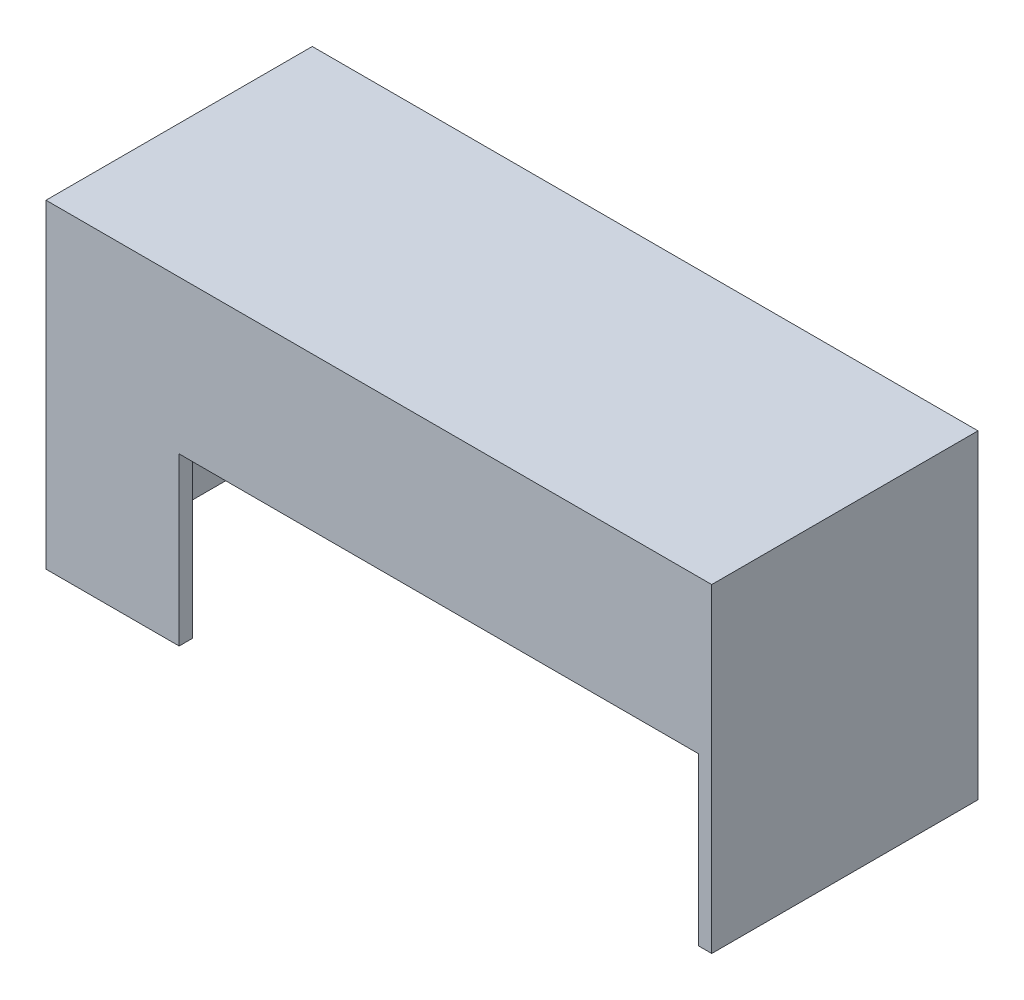
ISO-10303-21;
HEADER;
FILE_DESCRIPTION(('STEP AP214'),'2;1');
FILE_NAME('part.step','',(''),(''),'','','');
FILE_SCHEMA(('AUTOMOTIVE_DESIGN { 1 0 10303 214 1 1 1 1 }'));
ENDSEC;
DATA;
#1=APPLICATION_CONTEXT('core data for automotive mechanical design processes');
#2=APPLICATION_PROTOCOL_DEFINITION('international standard','automotive_design',2000,#1);
#3=PRODUCT_CONTEXT('',#1,'mechanical');
#4=PRODUCT('Part','Part','',(#3));
#5=PRODUCT_RELATED_PRODUCT_CATEGORY('part','',(#4));
#6=PRODUCT_DEFINITION_FORMATION('','',#4);
#7=PRODUCT_DEFINITION_CONTEXT('part definition',#1,'design');
#8=PRODUCT_DEFINITION('design','',#6,#7);
#9=PRODUCT_DEFINITION_SHAPE('','',#8);
#10=(LENGTH_UNIT() NAMED_UNIT(*) SI_UNIT(.MILLI.,.METRE.));
#11=(NAMED_UNIT(*) PLANE_ANGLE_UNIT() SI_UNIT($,.RADIAN.));
#12=(NAMED_UNIT(*) SI_UNIT($,.STERADIAN.) SOLID_ANGLE_UNIT());
#13=UNCERTAINTY_MEASURE_WITH_UNIT(LENGTH_MEASURE(1.E-05),#10,'distance_accuracy_value','');
#14=(GEOMETRIC_REPRESENTATION_CONTEXT(3) GLOBAL_UNCERTAINTY_ASSIGNED_CONTEXT((#13)) GLOBAL_UNIT_ASSIGNED_CONTEXT((#10,
#11,#12)) REPRESENTATION_CONTEXT('',''));
#15=CARTESIAN_POINT('',(0.,0.,0.));
#16=DIRECTION('',(0.,0.,1.));
#17=DIRECTION('',(1.,0.,0.));
#18=AXIS2_PLACEMENT_3D('',#15,#16,#17);
#19=CARTESIAN_POINT('',(-45.3195139385275,25.8398856325947,40.));
#20=DIRECTION('',(1.,0.,0.));
#21=DIRECTION('',(0.,1.,0.));
#22=AXIS2_PLACEMENT_3D('',#19,#20,#21);
#23=PLANE('',#22);
#24=DIRECTION('',(0.,-1.,0.));
#25=VECTOR('',#24,1.);
#26=CARTESIAN_POINT('',(-45.3195139385275,25.8398856325947,2.));
#27=LINE('',#26,#25);
#28=CARTESIAN_POINT('',(-45.3195139385275,23.8398856325947,2.));
#29=VERTEX_POINT('',#28);
#30=CARTESIAN_POINT('',(-45.3195139385275,-22.1601143674053,2.));
#31=VERTEX_POINT('',#30);
#32=EDGE_CURVE('E177',#29,#31,#27,.T.);
#33=ORIENTED_EDGE('',*,*,#32,.F.);
#34=DIRECTION('',(0.,0.,-1.));
#35=VECTOR('',#34,1.);
#36=CARTESIAN_POINT('',(-45.3195139385275,23.8398856325947,40.));
#37=LINE('',#36,#35);
#38=CARTESIAN_POINT('',(-45.3195139385275,23.8398856325947,38.));
#39=VERTEX_POINT('',#38);
#40=EDGE_CURVE('E247',#39,#29,#37,.T.);
#41=ORIENTED_EDGE('',*,*,#40,.F.);
#42=DIRECTION('',(0.,-1.,0.));
#43=VECTOR('',#42,1.);
#44=CARTESIAN_POINT('',(-45.3195139385275,25.8398856325947,38.));
#45=LINE('',#44,#43);
#46=CARTESIAN_POINT('',(-45.3195139385275,-22.1601143674053,38.));
#47=VERTEX_POINT('',#46);
#48=EDGE_CURVE('E148',#39,#47,#45,.T.);
#49=ORIENTED_EDGE('',*,*,#48,.T.);
#50=DIRECTION('',(0.,0.,-1.));
#51=VECTOR('',#50,1.);
#52=CARTESIAN_POINT('',(-45.3195139385275,-22.1601143674053,40.));
#53=LINE('',#52,#51);
#54=EDGE_CURVE('E108',#47,#31,#53,.T.);
#55=ORIENTED_EDGE('',*,*,#54,.T.);
#56=EDGE_LOOP('',(#33,#41,#49,#55));
#57=FACE_BOUND('',#56,.T.);
#58=ADVANCED_FACE('F44',(#57),#23,.T.);
#59=CARTESIAN_POINT('',(50.6804860614725,25.8398856325947,40.));
#60=DIRECTION('',(-1.,0.,0.));
#61=DIRECTION('',(0.,0.,1.));
#62=AXIS2_PLACEMENT_3D('',#59,#60,#61);
#63=PLANE('',#62);
#64=DIRECTION('',(0.,1.,0.));
#65=VECTOR('',#64,1.);
#66=CARTESIAN_POINT('',(50.6804860614725,25.8398856325947,40.));
#67=LINE('',#66,#65);
#68=CARTESIAN_POINT('',(50.6804860614725,-22.1601143674053,40.));
#69=VERTEX_POINT('',#68);
#70=CARTESIAN_POINT('',(50.6804860614725,2.83988563259471,40.));
#71=VERTEX_POINT('',#70);
#72=EDGE_CURVE('E189',#69,#71,#67,.T.);
#73=ORIENTED_EDGE('',*,*,#72,.T.);
#74=DIRECTION('',(0.,0.,-1.));
#75=VECTOR('',#74,1.);
#76=CARTESIAN_POINT('',(50.6804860614725,2.83988563259471,40.));
#77=LINE('',#76,#75);
#78=CARTESIAN_POINT('',(50.6804860614725,2.83988563259471,38.));
#79=VERTEX_POINT('',#78);
#80=EDGE_CURVE('E161',#71,#79,#77,.T.);
#81=ORIENTED_EDGE('',*,*,#80,.T.);
#82=DIRECTION('',(0.,1.,0.));
#83=VECTOR('',#82,1.);
#84=CARTESIAN_POINT('',(50.6804860614725,25.8398856325947,38.));
#85=LINE('',#84,#83);
#86=CARTESIAN_POINT('',(50.6804860614725,23.8398856325947,38.));
#87=VERTEX_POINT('',#86);
#88=EDGE_CURVE('E240',#79,#87,#85,.T.);
#89=ORIENTED_EDGE('',*,*,#88,.T.);
#90=DIRECTION('',(0.,0.,-1.));
#91=VECTOR('',#90,1.);
#92=CARTESIAN_POINT('',(50.6804860614725,23.8398856325947,40.));
#93=LINE('',#92,#91);
#94=CARTESIAN_POINT('',(50.6804860614725,23.8398856325947,2.));
#95=VERTEX_POINT('',#94);
#96=EDGE_CURVE('E154',#87,#95,#93,.T.);
#97=ORIENTED_EDGE('',*,*,#96,.T.);
#98=DIRECTION('',(0.,1.,0.));
#99=VECTOR('',#98,1.);
#100=CARTESIAN_POINT('',(50.6804860614725,25.8398856325947,2.));
#101=LINE('',#100,#99);
#102=CARTESIAN_POINT('',(50.6804860614725,-22.1601143674053,2.));
#103=VERTEX_POINT('',#102);
#104=EDGE_CURVE('E185',#103,#95,#101,.T.);
#105=ORIENTED_EDGE('',*,*,#104,.F.);
#106=DIRECTION('',(0.,0.,-1.));
#107=VECTOR('',#106,1.);
#108=CARTESIAN_POINT('',(50.6804860614725,-22.1601143674053,40.));
#109=LINE('',#108,#107);
#110=EDGE_CURVE('E114',#69,#103,#109,.T.);
#111=ORIENTED_EDGE('',*,*,#110,.F.);
#112=EDGE_LOOP('',(#73,#81,#89,#97,#105,#111));
#113=FACE_BOUND('',#112,.T.);
#114=ADVANCED_FACE('F234',(#113),#63,.T.);
#115=CARTESIAN_POINT('',(0.,0.,2.));
#116=DIRECTION('',(0.,0.,1.));
#117=DIRECTION('',(1.,0.,0.));
#118=AXIS2_PLACEMENT_3D('',#115,#116,#117);
#119=PLANE('',#118);
#120=ORIENTED_EDGE('',*,*,#104,.T.);
#121=DIRECTION('',(-1.,0.,0.));
#122=VECTOR('',#121,1.);
#123=CARTESIAN_POINT('',(-47.3195139385275,23.8398856325947,2.));
#124=LINE('',#123,#122);
#125=EDGE_CURVE('E250',#95,#29,#124,.T.);
#126=ORIENTED_EDGE('',*,*,#125,.T.);
#127=ORIENTED_EDGE('',*,*,#32,.T.);
#128=DIRECTION('',(1.,0.,0.));
#129=VECTOR('',#128,1.);
#130=CARTESIAN_POINT('',(-47.3195139385275,-22.1601143674053,2.));
#131=LINE('',#130,#129);
#132=EDGE_CURVE('E180',#31,#103,#131,.T.);
#133=ORIENTED_EDGE('',*,*,#132,.T.);
#134=EDGE_LOOP('',(#120,#126,#127,#133));
#135=FACE_BOUND('',#134,.T.);
#136=ADVANCED_FACE('F229',(#135),#119,.T.);
#137=CARTESIAN_POINT('',(-47.3195139385275,25.8398856325947,40.));
#138=DIRECTION('',(1.,0.,0.));
#139=DIRECTION('',(0.,1.,0.));
#140=AXIS2_PLACEMENT_3D('',#137,#138,#139);
#141=PLANE('',#140);
#142=DIRECTION('',(0.,0.,-1.));
#143=VECTOR('',#142,1.);
#144=CARTESIAN_POINT('',(-47.3195139385275,25.8398856325947,40.));
#145=LINE('',#144,#143);
#146=CARTESIAN_POINT('',(-47.3195139385275,25.8398856325947,40.));
#147=VERTEX_POINT('',#146);
#148=CARTESIAN_POINT('',(-47.3195139385275,25.8398856325947,0.));
#149=VERTEX_POINT('',#148);
#150=EDGE_CURVE('E82',#147,#149,#145,.T.);
#151=ORIENTED_EDGE('',*,*,#150,.T.);
#152=DIRECTION('',(0.,-1.,0.));
#153=VECTOR('',#152,1.);
#154=CARTESIAN_POINT('',(-47.3195139385275,25.8398856325947,0.));
#155=LINE('',#154,#153);
#156=CARTESIAN_POINT('',(-47.3195139385275,-22.1601143674053,0.));
#157=VERTEX_POINT('',#156);
#158=EDGE_CURVE('E87',#149,#157,#155,.T.);
#159=ORIENTED_EDGE('',*,*,#158,.T.);
#160=DIRECTION('',(0.,0.,1.));
#161=VECTOR('',#160,1.);
#162=CARTESIAN_POINT('',(-47.3195139385275,-22.1601143674053,0.));
#163=LINE('',#162,#161);
#164=CARTESIAN_POINT('',(-47.3195139385275,-22.1601143674053,40.));
#165=VERTEX_POINT('',#164);
#166=EDGE_CURVE('E164',#157,#165,#163,.T.);
#167=ORIENTED_EDGE('',*,*,#166,.T.);
#168=DIRECTION('',(0.,-1.,0.));
#169=VECTOR('',#168,1.);
#170=CARTESIAN_POINT('',(-47.3195139385275,25.8398856325947,40.));
#171=LINE('',#170,#169);
#172=EDGE_CURVE('E88',#147,#165,#171,.T.);
#173=ORIENTED_EDGE('',*,*,#172,.F.);
#174=EDGE_LOOP('',(#151,#159,#167,#173));
#175=FACE_BOUND('',#174,.T.);
#176=ADVANCED_FACE('F46',(#175),#141,.F.);
#177=CARTESIAN_POINT('',(52.6804860614725,25.8398856325947,40.));
#178=DIRECTION('',(-1.,0.,0.));
#179=DIRECTION('',(0.,0.,1.));
#180=AXIS2_PLACEMENT_3D('',#177,#178,#179);
#181=PLANE('',#180);
#182=DIRECTION('',(0.,1.,0.));
#183=VECTOR('',#182,1.);
#184=CARTESIAN_POINT('',(52.6804860614725,25.8398856325947,40.));
#185=LINE('',#184,#183);
#186=CARTESIAN_POINT('',(52.6804860614725,-22.1601143674053,40.));
#187=VERTEX_POINT('',#186);
#188=CARTESIAN_POINT('',(52.6804860614725,25.8398856325947,40.));
#189=VERTEX_POINT('',#188);
#190=EDGE_CURVE('E197',#187,#189,#185,.T.);
#191=ORIENTED_EDGE('',*,*,#190,.F.);
#192=DIRECTION('',(0.,0.,-1.));
#193=VECTOR('',#192,1.);
#194=CARTESIAN_POINT('',(52.6804860614725,-22.1601143674053,0.));
#195=LINE('',#194,#193);
#196=CARTESIAN_POINT('',(52.6804860614725,-22.1601143674053,0.));
#197=VERTEX_POINT('',#196);
#198=EDGE_CURVE('E171',#187,#197,#195,.T.);
#199=ORIENTED_EDGE('',*,*,#198,.T.);
#200=DIRECTION('',(0.,1.,0.));
#201=VECTOR('',#200,1.);
#202=CARTESIAN_POINT('',(52.6804860614725,25.8398856325947,0.));
#203=LINE('',#202,#201);
#204=CARTESIAN_POINT('',(52.6804860614725,25.8398856325947,0.));
#205=VERTEX_POINT('',#204);
#206=EDGE_CURVE('E101',#197,#205,#203,.T.);
#207=ORIENTED_EDGE('',*,*,#206,.T.);
#208=DIRECTION('',(0.,0.,-1.));
#209=VECTOR('',#208,1.);
#210=CARTESIAN_POINT('',(52.6804860614725,25.8398856325947,40.));
#211=LINE('',#210,#209);
#212=EDGE_CURVE('E91',#189,#205,#211,.T.);
#213=ORIENTED_EDGE('',*,*,#212,.F.);
#214=EDGE_LOOP('',(#191,#199,#207,#213));
#215=FACE_BOUND('',#214,.T.);
#216=ADVANCED_FACE('F207',(#215),#181,.F.);
#217=CARTESIAN_POINT('',(-47.3195139385275,25.8398856325947,40.));
#218=DIRECTION('',(0.,-1.,0.));
#219=DIRECTION('',(0.,0.,-1.));
#220=AXIS2_PLACEMENT_3D('',#217,#218,#219);
#221=PLANE('',#220);
#222=ORIENTED_EDGE('',*,*,#150,.F.);
#223=DIRECTION('',(-1.,0.,0.));
#224=VECTOR('',#223,1.);
#225=CARTESIAN_POINT('',(-47.3195139385275,25.8398856325947,40.));
#226=LINE('',#225,#224);
#227=EDGE_CURVE('E69',#189,#147,#226,.T.);
#228=ORIENTED_EDGE('',*,*,#227,.F.);
#229=ORIENTED_EDGE('',*,*,#212,.T.);
#230=DIRECTION('',(-1.,0.,0.));
#231=VECTOR('',#230,1.);
#232=CARTESIAN_POINT('',(-47.3195139385275,25.8398856325947,0.));
#233=LINE('',#232,#231);
#234=EDGE_CURVE('E95',#205,#149,#233,.T.);
#235=ORIENTED_EDGE('',*,*,#234,.T.);
#236=EDGE_LOOP('',(#222,#228,#229,#235));
#237=FACE_BOUND('',#236,.T.);
#238=ADVANCED_FACE('F96',(#237),#221,.F.);
#239=CARTESIAN_POINT('',(0.,0.,40.));
#240=DIRECTION('',(0.,0.,1.));
#241=DIRECTION('',(1.,0.,0.));
#242=AXIS2_PLACEMENT_3D('',#239,#240,#241);
#243=PLANE('',#242);
#244=DIRECTION('',(1.,0.,0.));
#245=VECTOR('',#244,1.);
#246=CARTESIAN_POINT('',(-47.3195139385275,-22.1601143674053,40.));
#247=LINE('',#246,#245);
#248=CARTESIAN_POINT('',(-27.3195139385275,-22.1601143674053,40.));
#249=VERTEX_POINT('',#248);
#250=EDGE_CURVE('E168',#165,#249,#247,.T.);
#251=ORIENTED_EDGE('',*,*,#250,.T.);
#252=DIRECTION('',(0.,1.,0.));
#253=VECTOR('',#252,1.);
#254=CARTESIAN_POINT('',(-27.3195139385275,25.8398856325947,40.));
#255=LINE('',#254,#253);
#256=CARTESIAN_POINT('',(-27.3195139385275,2.83988563259471,40.));
#257=VERTEX_POINT('',#256);
#258=EDGE_CURVE('E61',#249,#257,#255,.T.);
#259=ORIENTED_EDGE('',*,*,#258,.T.);
#260=DIRECTION('',(1.,0.,0.));
#261=VECTOR('',#260,1.);
#262=CARTESIAN_POINT('',(-45.3195139385275,2.83988563259471,40.));
#263=LINE('',#262,#261);
#264=EDGE_CURVE('E129',#257,#71,#263,.T.);
#265=ORIENTED_EDGE('',*,*,#264,.T.);
#266=ORIENTED_EDGE('',*,*,#72,.F.);
#267=EDGE_CURVE('E167',#69,#187,#247,.T.);
#268=ORIENTED_EDGE('',*,*,#267,.T.);
#269=ORIENTED_EDGE('',*,*,#190,.T.);
#270=ORIENTED_EDGE('',*,*,#227,.T.);
#271=ORIENTED_EDGE('',*,*,#172,.T.);
#272=EDGE_LOOP('',(#251,#259,#265,#266,#268,#269,#270,#271));
#273=FACE_BOUND('',#272,.T.);
#274=ADVANCED_FACE('F202',(#273),#243,.T.);
#275=CARTESIAN_POINT('',(0.,0.,0.));
#276=DIRECTION('',(0.,0.,1.));
#277=DIRECTION('',(1.,0.,0.));
#278=AXIS2_PLACEMENT_3D('',#275,#276,#277);
#279=PLANE('',#278);
#280=ORIENTED_EDGE('',*,*,#206,.F.);
#281=DIRECTION('',(-1.,0.,0.));
#282=VECTOR('',#281,1.);
#283=CARTESIAN_POINT('',(-47.3195139385275,-22.1601143674053,0.));
#284=LINE('',#283,#282);
#285=EDGE_CURVE('E106',#197,#157,#284,.T.);
#286=ORIENTED_EDGE('',*,*,#285,.T.);
#287=ORIENTED_EDGE('',*,*,#158,.F.);
#288=ORIENTED_EDGE('',*,*,#234,.F.);
#289=EDGE_LOOP('',(#280,#286,#287,#288));
#290=FACE_BOUND('',#289,.T.);
#291=ADVANCED_FACE('F104',(#290),#279,.F.);
#292=CARTESIAN_POINT('',(0.,-22.1601143674053,0.));
#293=DIRECTION('',(0.,1.,0.));
#294=DIRECTION('',(0.,0.,1.));
#295=AXIS2_PLACEMENT_3D('',#292,#293,#294);
#296=PLANE('',#295);
#297=ORIENTED_EDGE('',*,*,#250,.F.);
#298=ORIENTED_EDGE('',*,*,#166,.F.);
#299=ORIENTED_EDGE('',*,*,#285,.F.);
#300=ORIENTED_EDGE('',*,*,#198,.F.);
#301=ORIENTED_EDGE('',*,*,#267,.F.);
#302=ORIENTED_EDGE('',*,*,#110,.T.);
#303=ORIENTED_EDGE('',*,*,#132,.F.);
#304=ORIENTED_EDGE('',*,*,#54,.F.);
#305=DIRECTION('',(1.,0.,0.));
#306=VECTOR('',#305,1.);
#307=CARTESIAN_POINT('',(-47.3195139385275,-22.1601143674053,38.));
#308=LINE('',#307,#306);
#309=CARTESIAN_POINT('',(-27.3195139385275,-22.1601143674053,38.));
#310=VERTEX_POINT('',#309);
#311=EDGE_CURVE('E144',#47,#310,#308,.T.);
#312=ORIENTED_EDGE('',*,*,#311,.T.);
#313=DIRECTION('',(0.,0.,1.));
#314=VECTOR('',#313,1.);
#315=CARTESIAN_POINT('',(-27.3195139385275,-22.1601143674053,38.));
#316=LINE('',#315,#314);
#317=EDGE_CURVE('E140',#310,#249,#316,.T.);
#318=ORIENTED_EDGE('',*,*,#317,.T.);
#319=EDGE_LOOP('',(#297,#298,#299,#300,#301,#302,#303,#304,#312,#318));
#320=FACE_BOUND('',#319,.T.);
#321=ADVANCED_FACE('F224',(#320),#296,.F.);
#322=CARTESIAN_POINT('',(-45.3195139385275,2.83988563259471,40.));
#323=DIRECTION('',(0.,1.,0.));
#324=DIRECTION('',(-1.,0.,0.));
#325=AXIS2_PLACEMENT_3D('',#322,#323,#324);
#326=PLANE('',#325);
#327=DIRECTION('',(0.,0.,-1.));
#328=VECTOR('',#327,1.);
#329=CARTESIAN_POINT('',(-27.3195139385275,2.83988563259471,40.));
#330=LINE('',#329,#328);
#331=CARTESIAN_POINT('',(-27.3195139385275,2.83988563259471,38.));
#332=VERTEX_POINT('',#331);
#333=EDGE_CURVE('E48',#257,#332,#330,.T.);
#334=ORIENTED_EDGE('',*,*,#333,.T.);
#335=DIRECTION('',(1.,0.,0.));
#336=VECTOR('',#335,1.);
#337=CARTESIAN_POINT('',(-45.3195139385275,2.83988563259471,38.));
#338=LINE('',#337,#336);
#339=EDGE_CURVE('E11',#332,#79,#338,.T.);
#340=ORIENTED_EDGE('',*,*,#339,.T.);
#341=ORIENTED_EDGE('',*,*,#80,.F.);
#342=ORIENTED_EDGE('',*,*,#264,.F.);
#343=EDGE_LOOP('',(#334,#340,#341,#342));
#344=FACE_BOUND('',#343,.T.);
#345=ADVANCED_FACE('F124',(#344),#326,.F.);
#346=CARTESIAN_POINT('',(-27.3195139385275,25.8398856325947,38.));
#347=DIRECTION('',(1.,0.,0.));
#348=DIRECTION('',(0.,1.,0.));
#349=AXIS2_PLACEMENT_3D('',#346,#347,#348);
#350=PLANE('',#349);
#351=ORIENTED_EDGE('',*,*,#333,.F.);
#352=ORIENTED_EDGE('',*,*,#258,.F.);
#353=ORIENTED_EDGE('',*,*,#317,.F.);
#354=DIRECTION('',(0.,1.,0.));
#355=VECTOR('',#354,1.);
#356=CARTESIAN_POINT('',(-27.3195139385275,25.8398856325947,38.));
#357=LINE('',#356,#355);
#358=EDGE_CURVE('E137',#310,#332,#357,.T.);
#359=ORIENTED_EDGE('',*,*,#358,.T.);
#360=EDGE_LOOP('',(#351,#352,#353,#359));
#361=FACE_BOUND('',#360,.T.);
#362=ADVANCED_FACE('F134',(#361),#350,.T.);
#363=CARTESIAN_POINT('',(0.,0.,38.));
#364=DIRECTION('',(0.,0.,1.));
#365=DIRECTION('',(1.,0.,0.));
#366=AXIS2_PLACEMENT_3D('',#363,#364,#365);
#367=PLANE('',#366);
#368=ORIENTED_EDGE('',*,*,#48,.F.);
#369=DIRECTION('',(-1.,0.,0.));
#370=VECTOR('',#369,1.);
#371=CARTESIAN_POINT('',(-47.3195139385275,23.8398856325947,38.));
#372=LINE('',#371,#370);
#373=EDGE_CURVE('E256',#87,#39,#372,.T.);
#374=ORIENTED_EDGE('',*,*,#373,.F.);
#375=ORIENTED_EDGE('',*,*,#88,.F.);
#376=ORIENTED_EDGE('',*,*,#339,.F.);
#377=ORIENTED_EDGE('',*,*,#358,.F.);
#378=ORIENTED_EDGE('',*,*,#311,.F.);
#379=EDGE_LOOP('',(#368,#374,#375,#376,#377,#378));
#380=FACE_BOUND('',#379,.T.);
#381=ADVANCED_FACE('F275',(#380),#367,.F.);
#382=CARTESIAN_POINT('',(-47.3195139385275,23.8398856325947,40.));
#383=DIRECTION('',(0.,-1.,0.));
#384=DIRECTION('',(0.,0.,-1.));
#385=AXIS2_PLACEMENT_3D('',#382,#383,#384);
#386=PLANE('',#385);
#387=ORIENTED_EDGE('',*,*,#40,.T.);
#388=ORIENTED_EDGE('',*,*,#125,.F.);
#389=ORIENTED_EDGE('',*,*,#96,.F.);
#390=ORIENTED_EDGE('',*,*,#373,.T.);
#391=EDGE_LOOP('',(#387,#388,#389,#390));
#392=FACE_BOUND('',#391,.T.);
#393=ADVANCED_FACE('F251',(#392),#386,.T.);
#394=CLOSED_SHELL('',(#58,#114,#136,#176,#216,#238,#274,#291,#321,#345,#362,#381,#393));
#395=MANIFOLD_SOLID_BREP('B2',#394);
#396=ADVANCED_BREP_SHAPE_REPRESENTATION('',(#18,#395),#14);
#397=SHAPE_DEFINITION_REPRESENTATION(#9,#396);
ENDSEC;
END-ISO-10303-21;
